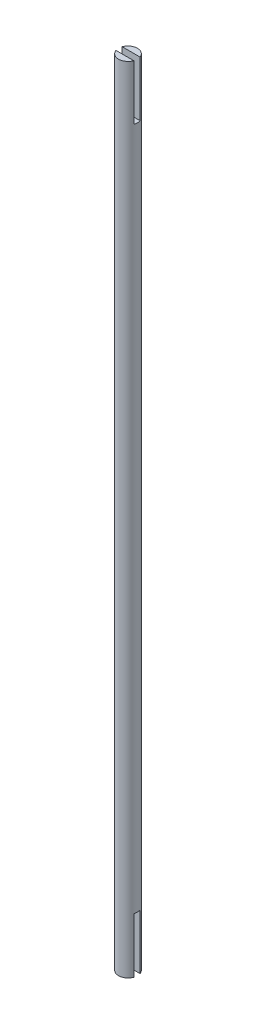
ISO-10303-21;
HEADER;
FILE_DESCRIPTION(('STEP AP214'),'2;1');
FILE_NAME('part.step','',(''),(''),'','','');
FILE_SCHEMA(('AUTOMOTIVE_DESIGN { 1 0 10303 214 1 1 1 1 }'));
ENDSEC;
DATA;
#1=APPLICATION_CONTEXT('core data for automotive mechanical design processes');
#2=APPLICATION_PROTOCOL_DEFINITION('international standard','automotive_design',2000,#1);
#3=PRODUCT_CONTEXT('',#1,'mechanical');
#4=PRODUCT('Part','Part','',(#3));
#5=PRODUCT_RELATED_PRODUCT_CATEGORY('part','',(#4));
#6=PRODUCT_DEFINITION_FORMATION('','',#4);
#7=PRODUCT_DEFINITION_CONTEXT('part definition',#1,'design');
#8=PRODUCT_DEFINITION('design','',#6,#7);
#9=PRODUCT_DEFINITION_SHAPE('','',#8);
#10=(LENGTH_UNIT() NAMED_UNIT(*) SI_UNIT(.MILLI.,.METRE.));
#11=(NAMED_UNIT(*) PLANE_ANGLE_UNIT() SI_UNIT($,.RADIAN.));
#12=(NAMED_UNIT(*) SI_UNIT($,.STERADIAN.) SOLID_ANGLE_UNIT());
#13=UNCERTAINTY_MEASURE_WITH_UNIT(LENGTH_MEASURE(1.E-05),#10,'distance_accuracy_value','');
#14=(GEOMETRIC_REPRESENTATION_CONTEXT(3) GLOBAL_UNCERTAINTY_ASSIGNED_CONTEXT((#13)) GLOBAL_UNIT_ASSIGNED_CONTEXT((#10,
#11,#12)) REPRESENTATION_CONTEXT('',''));
#15=CARTESIAN_POINT('',(0.,0.,0.));
#16=DIRECTION('',(0.,0.,1.));
#17=DIRECTION('',(1.,0.,0.));
#18=AXIS2_PLACEMENT_3D('',#15,#16,#17);
#19=CARTESIAN_POINT('',(0.,252.,0.));
#20=DIRECTION('',(0.,-1.,0.));
#21=DIRECTION('',(0.,0.,-1.));
#22=AXIS2_PLACEMENT_3D('',#19,#20,#21);
#23=CYLINDRICAL_SURFACE('',#22,3.);
#24=DIRECTION('',(0.,-1.,0.));
#25=VECTOR('',#24,1.);
#26=CARTESIAN_POINT('',(-2.82842712474619,252.,0.999999999999999));
#27=LINE('',#26,#25);
#28=CARTESIAN_POINT('',(-2.82842712474619,0.,1.));
#29=VERTEX_POINT('',#28);
#30=CARTESIAN_POINT('',(-2.82842712474619,17.5000000000001,0.999999999999999));
#31=VERTEX_POINT('',#30);
#32=EDGE_CURVE('E135',#29,#31,#27,.F.);
#33=ORIENTED_EDGE('',*,*,#32,.F.);
#34=CARTESIAN_POINT('',(0.,0.,0.));
#35=DIRECTION('',(0.,1.,0.));
#36=DIRECTION('',(0.,0.,1.));
#37=AXIS2_PLACEMENT_3D('',#34,#35,#36);
#38=CIRCLE('',#37,3.);
#39=CARTESIAN_POINT('',(2.82842712474619,0.,1.));
#40=VERTEX_POINT('',#39);
#41=EDGE_CURVE('E159',#29,#40,#38,.T.);
#42=ORIENTED_EDGE('',*,*,#41,.T.);
#43=DIRECTION('',(0.,-1.,0.));
#44=VECTOR('',#43,1.);
#45=CARTESIAN_POINT('',(2.82842712474619,252.,0.999999999999999));
#46=LINE('',#45,#44);
#47=CARTESIAN_POINT('',(2.82842712474619,17.5000000000001,0.999999999999999));
#48=VERTEX_POINT('',#47);
#49=EDGE_CURVE('E144',#48,#40,#46,.T.);
#50=ORIENTED_EDGE('',*,*,#49,.F.);
#51=CARTESIAN_POINT('',(0.,17.5000000000001,0.));
#52=DIRECTION('',(0.,-1.,0.));
#53=DIRECTION('',(0.,0.,-1.));
#54=AXIS2_PLACEMENT_3D('',#51,#52,#53);
#55=CIRCLE('',#54,3.);
#56=CARTESIAN_POINT('',(2.82842712474619,17.5000000000001,-1.));
#57=VERTEX_POINT('',#56);
#58=EDGE_CURVE('E119',#57,#48,#55,.T.);
#59=ORIENTED_EDGE('',*,*,#58,.F.);
#60=DIRECTION('',(0.,-1.,0.));
#61=VECTOR('',#60,1.);
#62=CARTESIAN_POINT('',(2.82842712474619,252.,-1.00000000000001));
#63=LINE('',#62,#61);
#64=CARTESIAN_POINT('',(2.82842712474619,0.,-1.));
#65=VERTEX_POINT('',#64);
#66=EDGE_CURVE('E123',#57,#65,#63,.T.);
#67=ORIENTED_EDGE('',*,*,#66,.T.);
#68=CARTESIAN_POINT('',(-2.82842712474619,0.,-1.));
#69=VERTEX_POINT('',#68);
#70=EDGE_CURVE('E129',#65,#69,#38,.T.);
#71=ORIENTED_EDGE('',*,*,#70,.T.);
#72=DIRECTION('',(0.,-1.,0.));
#73=VECTOR('',#72,1.);
#74=CARTESIAN_POINT('',(-2.82842712474619,252.,-1.00000000000001));
#75=LINE('',#74,#73);
#76=CARTESIAN_POINT('',(-2.82842712474619,17.5000000000001,-1.));
#77=VERTEX_POINT('',#76);
#78=EDGE_CURVE('E66',#69,#77,#75,.F.);
#79=ORIENTED_EDGE('',*,*,#78,.T.);
#80=EDGE_CURVE('E110',#31,#77,#55,.T.);
#81=ORIENTED_EDGE('',*,*,#80,.F.);
#82=EDGE_LOOP('',(#33,#42,#50,#59,#67,#71,#79,#81));
#83=FACE_BOUND('',#82,.T.);
#84=DIRECTION('',(0.,-1.,0.));
#85=VECTOR('',#84,1.);
#86=CARTESIAN_POINT('',(2.82842712474619,252.,-1.));
#87=LINE('',#86,#85);
#88=CARTESIAN_POINT('',(2.82842712474619,234.5,-1.));
#89=VERTEX_POINT('',#88);
#90=CARTESIAN_POINT('',(2.82842712474619,252.,-1.));
#91=VERTEX_POINT('',#90);
#92=EDGE_CURVE('E153',#89,#91,#87,.F.);
#93=ORIENTED_EDGE('',*,*,#92,.F.);
#94=CARTESIAN_POINT('',(0.,234.5,0.));
#95=DIRECTION('',(0.,-1.,0.));
#96=DIRECTION('',(0.,0.,-1.));
#97=AXIS2_PLACEMENT_3D('',#94,#95,#96);
#98=CIRCLE('',#97,3.);
#99=CARTESIAN_POINT('',(2.82842712474619,234.5,0.999999999999997));
#100=VERTEX_POINT('',#99);
#101=EDGE_CURVE('E46',#89,#100,#98,.T.);
#102=ORIENTED_EDGE('',*,*,#101,.T.);
#103=DIRECTION('',(0.,-1.,0.));
#104=VECTOR('',#103,1.);
#105=CARTESIAN_POINT('',(2.82842712474619,252.,0.999999999999999));
#106=LINE('',#105,#104);
#107=CARTESIAN_POINT('',(2.82842712474619,252.,1.));
#108=VERTEX_POINT('',#107);
#109=EDGE_CURVE('E147',#100,#108,#106,.F.);
#110=ORIENTED_EDGE('',*,*,#109,.T.);
#111=CARTESIAN_POINT('',(0.,252.,0.));
#112=DIRECTION('',(0.,1.,0.));
#113=DIRECTION('',(0.,0.,1.));
#114=AXIS2_PLACEMENT_3D('',#111,#112,#113);
#115=CIRCLE('',#114,3.);
#116=CARTESIAN_POINT('',(-2.82842712474619,252.,1.));
#117=VERTEX_POINT('',#116);
#118=EDGE_CURVE('E160',#117,#108,#115,.T.);
#119=ORIENTED_EDGE('',*,*,#118,.F.);
#120=DIRECTION('',(0.,-1.,0.));
#121=VECTOR('',#120,1.);
#122=CARTESIAN_POINT('',(-2.82842712474619,252.,0.999999999999999));
#123=LINE('',#122,#121);
#124=CARTESIAN_POINT('',(-2.82842712474619,234.5,0.999999999999997));
#125=VERTEX_POINT('',#124);
#126=EDGE_CURVE('E58',#117,#125,#123,.T.);
#127=ORIENTED_EDGE('',*,*,#126,.T.);
#128=CARTESIAN_POINT('',(-2.82842712474619,234.5,-1.));
#129=VERTEX_POINT('',#128);
#130=EDGE_CURVE('E11',#125,#129,#98,.T.);
#131=ORIENTED_EDGE('',*,*,#130,.T.);
#132=DIRECTION('',(0.,-1.,0.));
#133=VECTOR('',#132,1.);
#134=CARTESIAN_POINT('',(-2.82842712474619,252.,-1.));
#135=LINE('',#134,#133);
#136=CARTESIAN_POINT('',(-2.82842712474619,252.,-1.));
#137=VERTEX_POINT('',#136);
#138=EDGE_CURVE('E156',#137,#129,#135,.T.);
#139=ORIENTED_EDGE('',*,*,#138,.F.);
#140=EDGE_CURVE('E164',#91,#137,#115,.T.);
#141=ORIENTED_EDGE('',*,*,#140,.F.);
#142=EDGE_LOOP('',(#93,#102,#110,#119,#127,#131,#139,#141));
#143=FACE_BOUND('',#142,.T.);
#144=ADVANCED_FACE('F43',(#83,#143),#23,.T.);
#145=CARTESIAN_POINT('',(0.,252.,0.));
#146=DIRECTION('',(0.,1.,0.));
#147=DIRECTION('',(0.,0.,1.));
#148=AXIS2_PLACEMENT_3D('',#145,#146,#147);
#149=PLANE('',#148);
#150=ORIENTED_EDGE('',*,*,#140,.T.);
#151=DIRECTION('',(1.,0.,0.));
#152=VECTOR('',#151,1.);
#153=CARTESIAN_POINT('',(0.,252.,-1.));
#154=LINE('',#153,#152);
#155=EDGE_CURVE('E177',#137,#91,#154,.T.);
#156=ORIENTED_EDGE('',*,*,#155,.T.);
#157=EDGE_LOOP('',(#150,#156));
#158=FACE_BOUND('',#157,.T.);
#159=ADVANCED_FACE('F191',(#158),#149,.T.);
#160=CARTESIAN_POINT('',(0.,0.,0.));
#161=DIRECTION('',(0.,1.,0.));
#162=DIRECTION('',(0.,0.,1.));
#163=AXIS2_PLACEMENT_3D('',#160,#161,#162);
#164=PLANE('',#163);
#165=DIRECTION('',(-1.,0.,0.));
#166=VECTOR('',#165,1.);
#167=CARTESIAN_POINT('',(0.,0.,1.));
#168=LINE('',#167,#166);
#169=EDGE_CURVE('E171',#40,#29,#168,.T.);
#170=ORIENTED_EDGE('',*,*,#169,.F.);
#171=ORIENTED_EDGE('',*,*,#41,.F.);
#172=EDGE_LOOP('',(#170,#171));
#173=FACE_BOUND('',#172,.T.);
#174=ADVANCED_FACE('F188',(#173),#164,.F.);
#175=DIRECTION('',(1.,0.,0.));
#176=VECTOR('',#175,1.);
#177=CARTESIAN_POINT('',(0.,252.,1.));
#178=LINE('',#177,#176);
#179=EDGE_CURVE('E174',#117,#108,#178,.T.);
#180=ORIENTED_EDGE('',*,*,#179,.F.);
#181=ORIENTED_EDGE('',*,*,#118,.T.);
#182=EDGE_LOOP('',(#180,#181));
#183=FACE_BOUND('',#182,.T.);
#184=ADVANCED_FACE('F190',(#183),#149,.T.);
#185=ORIENTED_EDGE('',*,*,#70,.F.);
#186=DIRECTION('',(-1.,0.,0.));
#187=VECTOR('',#186,1.);
#188=CARTESIAN_POINT('',(0.,0.,-1.));
#189=LINE('',#188,#187);
#190=EDGE_CURVE('E168',#65,#69,#189,.T.);
#191=ORIENTED_EDGE('',*,*,#190,.T.);
#192=EDGE_LOOP('',(#185,#191));
#193=FACE_BOUND('',#192,.T.);
#194=ADVANCED_FACE('F192',(#193),#164,.F.);
#195=CARTESIAN_POINT('',(-3.,17.5000000000001,0.));
#196=DIRECTION('',(0.,-1.,0.));
#197=DIRECTION('',(0.,0.,-1.));
#198=AXIS2_PLACEMENT_3D('',#195,#196,#197);
#199=PLANE('',#198);
#200=DIRECTION('',(1.,0.,0.));
#201=VECTOR('',#200,1.);
#202=CARTESIAN_POINT('',(-3.,17.5000000000001,-1.));
#203=LINE('',#202,#201);
#204=EDGE_CURVE('E112',#77,#57,#203,.T.);
#205=ORIENTED_EDGE('',*,*,#204,.T.);
#206=ORIENTED_EDGE('',*,*,#58,.T.);
#207=DIRECTION('',(1.,0.,0.));
#208=VECTOR('',#207,1.);
#209=CARTESIAN_POINT('',(-3.,17.5000000000001,1.));
#210=LINE('',#209,#208);
#211=EDGE_CURVE('E114',#31,#48,#210,.T.);
#212=ORIENTED_EDGE('',*,*,#211,.F.);
#213=ORIENTED_EDGE('',*,*,#80,.T.);
#214=EDGE_LOOP('',(#205,#206,#212,#213));
#215=FACE_BOUND('',#214,.T.);
#216=ADVANCED_FACE('F111',(#215),#199,.T.);
#217=CARTESIAN_POINT('',(-3.,0.,1.));
#218=DIRECTION('',(0.,0.,-1.));
#219=DIRECTION('',(-1.,0.,0.));
#220=AXIS2_PLACEMENT_3D('',#217,#218,#219);
#221=PLANE('',#220);
#222=ORIENTED_EDGE('',*,*,#49,.T.);
#223=ORIENTED_EDGE('',*,*,#169,.T.);
#224=ORIENTED_EDGE('',*,*,#32,.T.);
#225=ORIENTED_EDGE('',*,*,#211,.T.);
#226=EDGE_LOOP('',(#222,#223,#224,#225));
#227=FACE_BOUND('',#226,.T.);
#228=ADVANCED_FACE('F183',(#227),#221,.T.);
#229=CARTESIAN_POINT('',(-3.,0.,-1.));
#230=DIRECTION('',(0.,0.,-1.));
#231=DIRECTION('',(0.,1.,0.));
#232=AXIS2_PLACEMENT_3D('',#229,#230,#231);
#233=PLANE('',#232);
#234=ORIENTED_EDGE('',*,*,#204,.F.);
#235=ORIENTED_EDGE('',*,*,#78,.F.);
#236=ORIENTED_EDGE('',*,*,#190,.F.);
#237=ORIENTED_EDGE('',*,*,#66,.F.);
#238=EDGE_LOOP('',(#234,#235,#236,#237));
#239=FACE_BOUND('',#238,.T.);
#240=ADVANCED_FACE('F121',(#239),#233,.F.);
#241=CARTESIAN_POINT('',(-3.,234.5,0.));
#242=DIRECTION('',(0.,-1.,0.));
#243=DIRECTION('',(0.,0.,-1.));
#244=AXIS2_PLACEMENT_3D('',#241,#242,#243);
#245=PLANE('',#244);
#246=DIRECTION('',(1.,0.,0.));
#247=VECTOR('',#246,1.);
#248=CARTESIAN_POINT('',(-3.,234.5,-1.));
#249=LINE('',#248,#247);
#250=EDGE_CURVE('E131',#129,#89,#249,.T.);
#251=ORIENTED_EDGE('',*,*,#250,.F.);
#252=ORIENTED_EDGE('',*,*,#130,.F.);
#253=DIRECTION('',(1.,0.,0.));
#254=VECTOR('',#253,1.);
#255=CARTESIAN_POINT('',(-3.,234.5,0.999999999999997));
#256=LINE('',#255,#254);
#257=EDGE_CURVE('E138',#125,#100,#256,.T.);
#258=ORIENTED_EDGE('',*,*,#257,.T.);
#259=ORIENTED_EDGE('',*,*,#101,.F.);
#260=EDGE_LOOP('',(#251,#252,#258,#259));
#261=FACE_BOUND('',#260,.T.);
#262=ADVANCED_FACE('F257',(#261),#245,.F.);
#263=CARTESIAN_POINT('',(-3.,0.,-1.00000000000003));
#264=DIRECTION('',(0.,0.,1.));
#265=DIRECTION('',(0.,-1.,0.));
#266=AXIS2_PLACEMENT_3D('',#263,#264,#265);
#267=PLANE('',#266);
#268=ORIENTED_EDGE('',*,*,#138,.T.);
#269=ORIENTED_EDGE('',*,*,#250,.T.);
#270=ORIENTED_EDGE('',*,*,#92,.T.);
#271=ORIENTED_EDGE('',*,*,#155,.F.);
#272=EDGE_LOOP('',(#268,#269,#270,#271));
#273=FACE_BOUND('',#272,.T.);
#274=ADVANCED_FACE('F267',(#273),#267,.T.);
#275=CARTESIAN_POINT('',(-3.,0.,0.999999999999968));
#276=DIRECTION('',(0.,0.,1.));
#277=DIRECTION('',(0.,-1.,0.));
#278=AXIS2_PLACEMENT_3D('',#275,#276,#277);
#279=PLANE('',#278);
#280=ORIENTED_EDGE('',*,*,#179,.T.);
#281=ORIENTED_EDGE('',*,*,#109,.F.);
#282=ORIENTED_EDGE('',*,*,#257,.F.);
#283=ORIENTED_EDGE('',*,*,#126,.F.);
#284=EDGE_LOOP('',(#280,#281,#282,#283));
#285=FACE_BOUND('',#284,.T.);
#286=ADVANCED_FACE('F278',(#285),#279,.F.);
#287=CLOSED_SHELL('',(#144,#159,#174,#184,#194,#216,#228,#240,#262,#274,#286));
#288=MANIFOLD_SOLID_BREP('B2',#287);
#289=ADVANCED_BREP_SHAPE_REPRESENTATION('',(#18,#288),#14);
#290=SHAPE_DEFINITION_REPRESENTATION(#9,#289);
ENDSEC;
END-ISO-10303-21;
